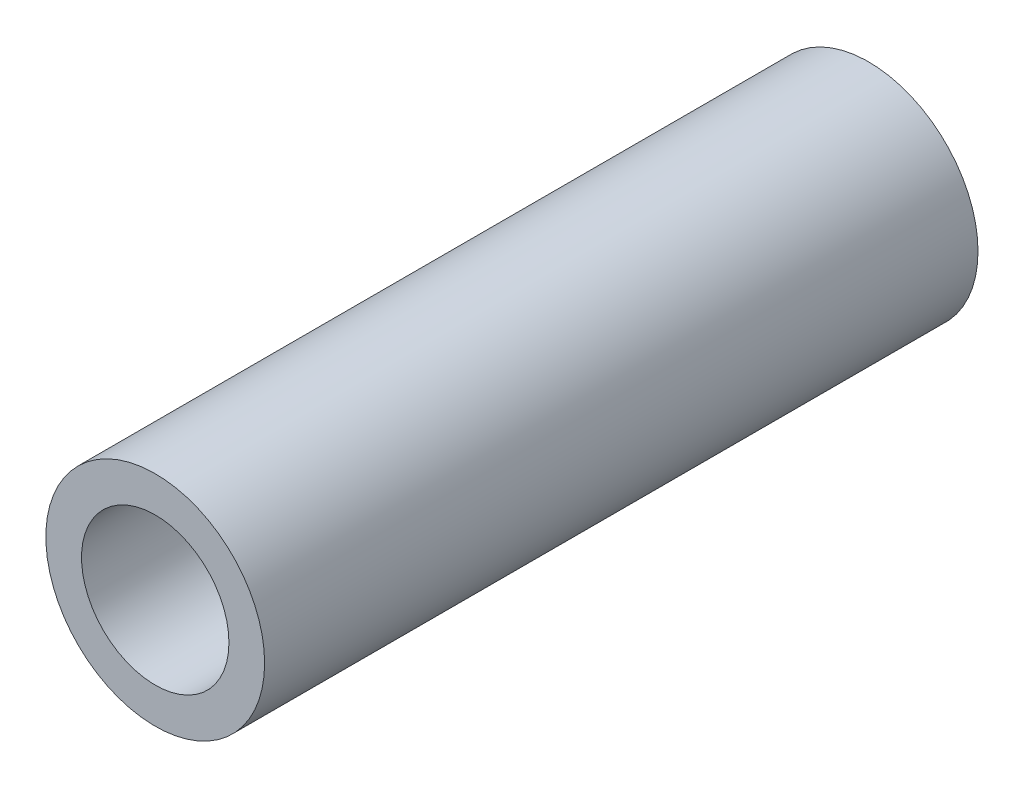
ISO-10303-21;
HEADER;
FILE_DESCRIPTION(('STEP AP214'),'2;1');
FILE_NAME('part.step','',(''),(''),'','','');
FILE_SCHEMA(('AUTOMOTIVE_DESIGN { 1 0 10303 214 1 1 1 1 }'));
ENDSEC;
DATA;
#1=APPLICATION_CONTEXT('core data for automotive mechanical design processes');
#2=APPLICATION_PROTOCOL_DEFINITION('international standard','automotive_design',2000,#1);
#3=PRODUCT_CONTEXT('',#1,'mechanical');
#4=PRODUCT('Part','Part','',(#3));
#5=PRODUCT_RELATED_PRODUCT_CATEGORY('part','',(#4));
#6=PRODUCT_DEFINITION_FORMATION('','',#4);
#7=PRODUCT_DEFINITION_CONTEXT('part definition',#1,'design');
#8=PRODUCT_DEFINITION('design','',#6,#7);
#9=PRODUCT_DEFINITION_SHAPE('','',#8);
#10=(LENGTH_UNIT() NAMED_UNIT(*) SI_UNIT(.MILLI.,.METRE.));
#11=(NAMED_UNIT(*) PLANE_ANGLE_UNIT() SI_UNIT($,.RADIAN.));
#12=(NAMED_UNIT(*) SI_UNIT($,.STERADIAN.) SOLID_ANGLE_UNIT());
#13=UNCERTAINTY_MEASURE_WITH_UNIT(LENGTH_MEASURE(1.E-05),#10,'distance_accuracy_value','');
#14=(GEOMETRIC_REPRESENTATION_CONTEXT(3) GLOBAL_UNCERTAINTY_ASSIGNED_CONTEXT((#13)) GLOBAL_UNIT_ASSIGNED_CONTEXT((#10,
#11,#12)) REPRESENTATION_CONTEXT('',''));
#15=CARTESIAN_POINT('',(0.,0.,0.));
#16=DIRECTION('',(0.,0.,1.));
#17=DIRECTION('',(1.,0.,0.));
#18=AXIS2_PLACEMENT_3D('',#15,#16,#17);
#19=CARTESIAN_POINT('',(0.,0.,15.));
#20=DIRECTION('',(0.,0.,1.));
#21=DIRECTION('',(1.,0.,0.));
#22=AXIS2_PLACEMENT_3D('',#19,#20,#21);
#23=PLANE('',#22);
#24=CARTESIAN_POINT('',(0.,0.,15.));
#25=DIRECTION('',(0.,0.,1.));
#26=DIRECTION('',(1.,0.,0.));
#27=AXIS2_PLACEMENT_3D('',#24,#25,#26);
#28=CIRCLE('',#27,2.3);
#29=CARTESIAN_POINT('',(2.3,0.,15.));
#30=VERTEX_POINT('',#29);
#31=EDGE_CURVE('E10',#30,#30,#28,.T.);
#32=ORIENTED_EDGE('',*,*,#31,.T.);
#33=EDGE_LOOP('',(#32));
#34=FACE_BOUND('',#33,.T.);
#35=CARTESIAN_POINT('',(0.,0.,15.));
#36=DIRECTION('',(0.,0.,1.));
#37=DIRECTION('',(1.,0.,0.));
#38=AXIS2_PLACEMENT_3D('',#35,#36,#37);
#39=CIRCLE('',#38,1.55);
#40=CARTESIAN_POINT('',(1.55,0.,15.));
#41=VERTEX_POINT('',#40);
#42=EDGE_CURVE('E52',#41,#41,#39,.T.);
#43=ORIENTED_EDGE('',*,*,#42,.F.);
#44=EDGE_LOOP('',(#43));
#45=FACE_BOUND('',#44,.T.);
#46=ADVANCED_FACE('F39',(#34,#45),#23,.T.);
#47=CARTESIAN_POINT('',(0.,0.,0.));
#48=DIRECTION('',(0.,0.,1.));
#49=DIRECTION('',(1.,0.,0.));
#50=AXIS2_PLACEMENT_3D('',#47,#48,#49);
#51=PLANE('',#50);
#52=CARTESIAN_POINT('',(0.,0.,0.));
#53=DIRECTION('',(0.,0.,1.));
#54=DIRECTION('',(1.,0.,0.));
#55=AXIS2_PLACEMENT_3D('',#52,#53,#54);
#56=CIRCLE('',#55,2.3);
#57=CARTESIAN_POINT('',(2.3,0.,0.));
#58=VERTEX_POINT('',#57);
#59=EDGE_CURVE('E43',#58,#58,#56,.T.);
#60=ORIENTED_EDGE('',*,*,#59,.F.);
#61=EDGE_LOOP('',(#60));
#62=FACE_BOUND('',#61,.T.);
#63=CARTESIAN_POINT('',(0.,0.,0.));
#64=DIRECTION('',(0.,0.,1.));
#65=DIRECTION('',(1.,0.,0.));
#66=AXIS2_PLACEMENT_3D('',#63,#64,#65);
#67=CIRCLE('',#66,1.55);
#68=CARTESIAN_POINT('',(1.55,0.,0.));
#69=VERTEX_POINT('',#68);
#70=EDGE_CURVE('E54',#69,#69,#67,.T.);
#71=ORIENTED_EDGE('',*,*,#70,.T.);
#72=EDGE_LOOP('',(#71));
#73=FACE_BOUND('',#72,.T.);
#74=ADVANCED_FACE('F66',(#62,#73),#51,.F.);
#75=CARTESIAN_POINT('',(0.,0.,15.));
#76=DIRECTION('',(0.,0.,-1.));
#77=DIRECTION('',(-1.,0.,0.));
#78=AXIS2_PLACEMENT_3D('',#75,#76,#77);
#79=CYLINDRICAL_SURFACE('',#78,2.3);
#80=ORIENTED_EDGE('',*,*,#31,.F.);
#81=EDGE_LOOP('',(#80));
#82=FACE_BOUND('',#81,.T.);
#83=ORIENTED_EDGE('',*,*,#59,.T.);
#84=EDGE_LOOP('',(#83));
#85=FACE_BOUND('',#84,.T.);
#86=ADVANCED_FACE('F41',(#82,#85),#79,.T.);
#87=CARTESIAN_POINT('',(0.,0.,15.));
#88=DIRECTION('',(0.,0.,-1.));
#89=DIRECTION('',(-1.,0.,0.));
#90=AXIS2_PLACEMENT_3D('',#87,#88,#89);
#91=CYLINDRICAL_SURFACE('',#90,1.55);
#92=ORIENTED_EDGE('',*,*,#42,.T.);
#93=EDGE_LOOP('',(#92));
#94=FACE_BOUND('',#93,.T.);
#95=ORIENTED_EDGE('',*,*,#70,.F.);
#96=EDGE_LOOP('',(#95));
#97=FACE_BOUND('',#96,.T.);
#98=ADVANCED_FACE('F62',(#94,#97),#91,.F.);
#99=CLOSED_SHELL('',(#46,#74,#86,#98));
#100=MANIFOLD_SOLID_BREP('B2',#99);
#101=ADVANCED_BREP_SHAPE_REPRESENTATION('',(#18,#100),#14);
#102=SHAPE_DEFINITION_REPRESENTATION(#9,#101);
ENDSEC;
END-ISO-10303-21;
